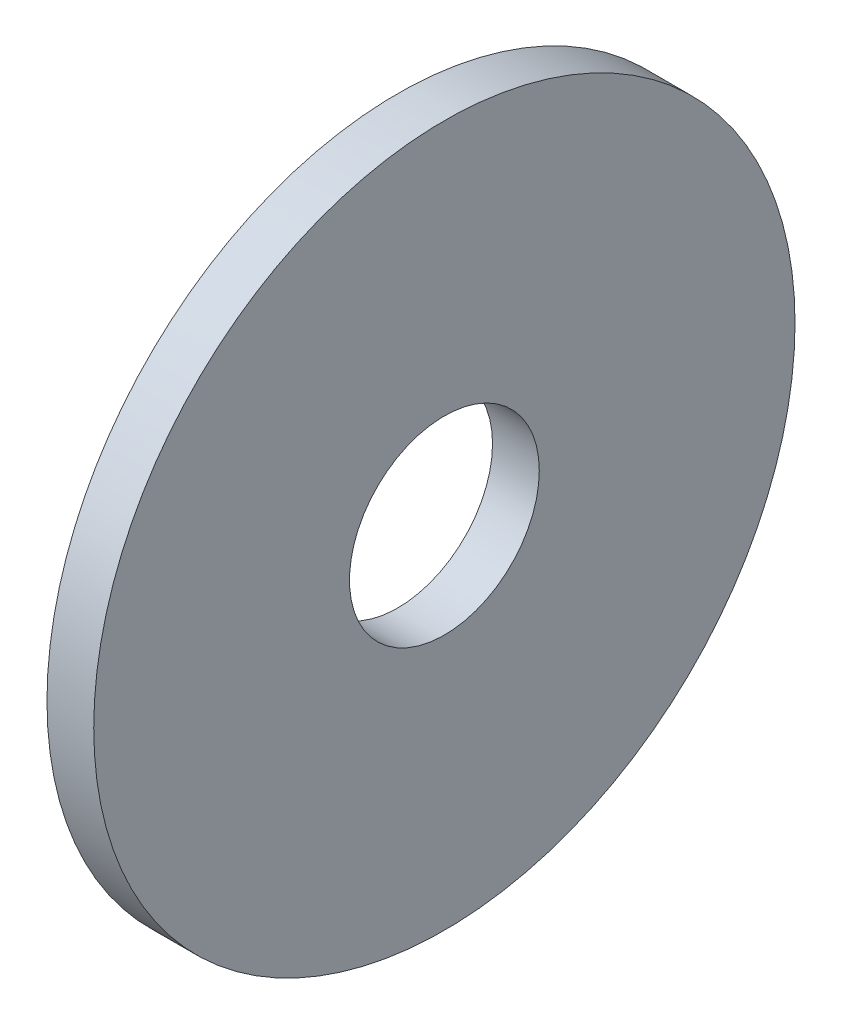
ISO-10303-21;
HEADER;
FILE_DESCRIPTION(('STEP AP214'),'2;1');
FILE_NAME('part.step','',(''),(''),'','','');
FILE_SCHEMA(('AUTOMOTIVE_DESIGN { 1 0 10303 214 1 1 1 1 }'));
ENDSEC;
DATA;
#1=APPLICATION_CONTEXT('core data for automotive mechanical design processes');
#2=APPLICATION_PROTOCOL_DEFINITION('international standard','automotive_design',2000,#1);
#3=PRODUCT_CONTEXT('',#1,'mechanical');
#4=PRODUCT('Part','Part','',(#3));
#5=PRODUCT_RELATED_PRODUCT_CATEGORY('part','',(#4));
#6=PRODUCT_DEFINITION_FORMATION('','',#4);
#7=PRODUCT_DEFINITION_CONTEXT('part definition',#1,'design');
#8=PRODUCT_DEFINITION('design','',#6,#7);
#9=PRODUCT_DEFINITION_SHAPE('','',#8);
#10=(LENGTH_UNIT() NAMED_UNIT(*) SI_UNIT(.MILLI.,.METRE.));
#11=(NAMED_UNIT(*) PLANE_ANGLE_UNIT() SI_UNIT($,.RADIAN.));
#12=(NAMED_UNIT(*) SI_UNIT($,.STERADIAN.) SOLID_ANGLE_UNIT());
#13=UNCERTAINTY_MEASURE_WITH_UNIT(LENGTH_MEASURE(1.E-05),#10,'distance_accuracy_value','');
#14=(GEOMETRIC_REPRESENTATION_CONTEXT(3) GLOBAL_UNCERTAINTY_ASSIGNED_CONTEXT((#13)) GLOBAL_UNIT_ASSIGNED_CONTEXT((#10,
#11,#12)) REPRESENTATION_CONTEXT('',''));
#15=CARTESIAN_POINT('',(0.,0.,0.));
#16=DIRECTION('',(0.,0.,1.));
#17=DIRECTION('',(1.,0.,0.));
#18=AXIS2_PLACEMENT_3D('',#15,#16,#17);
#19=CARTESIAN_POINT('',(1.27,0.,0.));
#20=DIRECTION('',(1.,0.,0.));
#21=DIRECTION('',(0.,0.,-1.));
#22=AXIS2_PLACEMENT_3D('',#19,#20,#21);
#23=PLANE('',#22);
#24=CARTESIAN_POINT('',(1.27,0.,0.));
#25=DIRECTION('',(1.,0.,0.));
#26=DIRECTION('',(0.,0.,-1.));
#27=AXIS2_PLACEMENT_3D('',#24,#25,#26);
#28=CIRCLE('',#27,9.525);
#29=CARTESIAN_POINT('',(1.27,0.,-9.525));
#30=VERTEX_POINT('',#29);
#31=EDGE_CURVE('E10',#30,#30,#28,.T.);
#32=ORIENTED_EDGE('',*,*,#31,.T.);
#33=EDGE_LOOP('',(#32));
#34=FACE_BOUND('',#33,.T.);
#35=CARTESIAN_POINT('',(1.27,0.,0.));
#36=DIRECTION('',(1.,0.,0.));
#37=DIRECTION('',(0.,0.,-1.));
#38=AXIS2_PLACEMENT_3D('',#35,#36,#37);
#39=CIRCLE('',#38,2.5781);
#40=CARTESIAN_POINT('',(1.27,0.,-2.5781));
#41=VERTEX_POINT('',#40);
#42=EDGE_CURVE('E41',#41,#41,#39,.T.);
#43=ORIENTED_EDGE('',*,*,#42,.F.);
#44=EDGE_LOOP('',(#43));
#45=FACE_BOUND('',#44,.T.);
#46=ADVANCED_FACE('F30',(#34,#45),#23,.T.);
#47=CARTESIAN_POINT('',(0.,0.,0.));
#48=DIRECTION('',(1.,0.,0.));
#49=DIRECTION('',(0.,0.,-1.));
#50=AXIS2_PLACEMENT_3D('',#47,#48,#49);
#51=PLANE('',#50);
#52=CARTESIAN_POINT('',(0.,0.,0.));
#53=DIRECTION('',(1.,0.,0.));
#54=DIRECTION('',(0.,0.,-1.));
#55=AXIS2_PLACEMENT_3D('',#52,#53,#54);
#56=CIRCLE('',#55,9.525);
#57=CARTESIAN_POINT('',(0.,0.,-9.525));
#58=VERTEX_POINT('',#57);
#59=EDGE_CURVE('E34',#58,#58,#56,.T.);
#60=ORIENTED_EDGE('',*,*,#59,.F.);
#61=EDGE_LOOP('',(#60));
#62=FACE_BOUND('',#61,.T.);
#63=CARTESIAN_POINT('',(0.,0.,0.));
#64=DIRECTION('',(1.,0.,0.));
#65=DIRECTION('',(0.,0.,-1.));
#66=AXIS2_PLACEMENT_3D('',#63,#64,#65);
#67=CIRCLE('',#66,2.5781);
#68=CARTESIAN_POINT('',(0.,0.,-2.5781));
#69=VERTEX_POINT('',#68);
#70=EDGE_CURVE('E43',#69,#69,#67,.T.);
#71=ORIENTED_EDGE('',*,*,#70,.T.);
#72=EDGE_LOOP('',(#71));
#73=FACE_BOUND('',#72,.T.);
#74=ADVANCED_FACE('F53',(#62,#73),#51,.F.);
#75=CARTESIAN_POINT('',(1.27,0.,0.));
#76=DIRECTION('',(-1.,0.,0.));
#77=DIRECTION('',(0.,0.,1.));
#78=AXIS2_PLACEMENT_3D('',#75,#76,#77);
#79=CYLINDRICAL_SURFACE('',#78,9.525);
#80=ORIENTED_EDGE('',*,*,#31,.F.);
#81=EDGE_LOOP('',(#80));
#82=FACE_BOUND('',#81,.T.);
#83=ORIENTED_EDGE('',*,*,#59,.T.);
#84=EDGE_LOOP('',(#83));
#85=FACE_BOUND('',#84,.T.);
#86=ADVANCED_FACE('F32',(#82,#85),#79,.T.);
#87=CARTESIAN_POINT('',(1.27,0.,0.));
#88=DIRECTION('',(-1.,0.,0.));
#89=DIRECTION('',(0.,0.,1.));
#90=AXIS2_PLACEMENT_3D('',#87,#88,#89);
#91=CYLINDRICAL_SURFACE('',#90,2.5781);
#92=ORIENTED_EDGE('',*,*,#42,.T.);
#93=EDGE_LOOP('',(#92));
#94=FACE_BOUND('',#93,.T.);
#95=ORIENTED_EDGE('',*,*,#70,.F.);
#96=EDGE_LOOP('',(#95));
#97=FACE_BOUND('',#96,.T.);
#98=ADVANCED_FACE('F49',(#94,#97),#91,.F.);
#99=CLOSED_SHELL('',(#46,#74,#86,#98));
#100=MANIFOLD_SOLID_BREP('B2',#99);
#101=ADVANCED_BREP_SHAPE_REPRESENTATION('',(#18,#100),#14);
#102=SHAPE_DEFINITION_REPRESENTATION(#9,#101);
ENDSEC;
END-ISO-10303-21;
